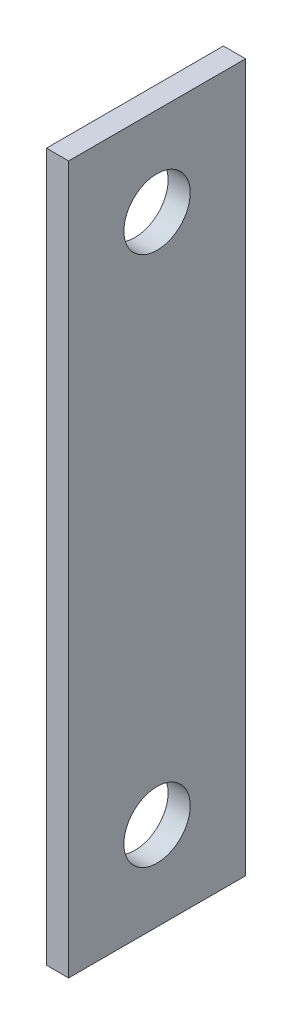
ISO-10303-21;
HEADER;
FILE_DESCRIPTION(('STEP AP214'),'2;1');
FILE_NAME('part.step','',(''),(''),'','','');
FILE_SCHEMA(('AUTOMOTIVE_DESIGN { 1 0 10303 214 1 1 1 1 }'));
ENDSEC;
DATA;
#1=APPLICATION_CONTEXT('core data for automotive mechanical design processes');
#2=APPLICATION_PROTOCOL_DEFINITION('international standard','automotive_design',2000,#1);
#3=PRODUCT_CONTEXT('',#1,'mechanical');
#4=PRODUCT('Part','Part','',(#3));
#5=PRODUCT_RELATED_PRODUCT_CATEGORY('part','',(#4));
#6=PRODUCT_DEFINITION_FORMATION('','',#4);
#7=PRODUCT_DEFINITION_CONTEXT('part definition',#1,'design');
#8=PRODUCT_DEFINITION('design','',#6,#7);
#9=PRODUCT_DEFINITION_SHAPE('','',#8);
#10=(LENGTH_UNIT() NAMED_UNIT(*) SI_UNIT(.MILLI.,.METRE.));
#11=(NAMED_UNIT(*) PLANE_ANGLE_UNIT() SI_UNIT($,.RADIAN.));
#12=(NAMED_UNIT(*) SI_UNIT($,.STERADIAN.) SOLID_ANGLE_UNIT());
#13=UNCERTAINTY_MEASURE_WITH_UNIT(LENGTH_MEASURE(1.E-05),#10,'distance_accuracy_value','');
#14=(GEOMETRIC_REPRESENTATION_CONTEXT(3) GLOBAL_UNCERTAINTY_ASSIGNED_CONTEXT((#13)) GLOBAL_UNIT_ASSIGNED_CONTEXT((#10,
#11,#12)) REPRESENTATION_CONTEXT('',''));
#15=CARTESIAN_POINT('',(0.,0.,0.));
#16=DIRECTION('',(0.,0.,1.));
#17=DIRECTION('',(1.,0.,0.));
#18=AXIS2_PLACEMENT_3D('',#15,#16,#17);
#19=CARTESIAN_POINT('',(3.175,0.,0.));
#20=DIRECTION('',(-1.,0.,0.));
#21=DIRECTION('',(0.,0.,1.));
#22=AXIS2_PLACEMENT_3D('',#19,#20,#21);
#23=PLANE('',#22);
#24=DIRECTION('',(0.,1.,0.));
#25=VECTOR('',#24,1.);
#26=CARTESIAN_POINT('',(3.175,-50.8,-12.7));
#27=LINE('',#26,#25);
#28=CARTESIAN_POINT('',(3.175,-50.8,-12.7));
#29=VERTEX_POINT('',#28);
#30=CARTESIAN_POINT('',(3.175,50.8,-12.7));
#31=VERTEX_POINT('',#30);
#32=EDGE_CURVE('E89',#29,#31,#27,.T.);
#33=ORIENTED_EDGE('',*,*,#32,.T.);
#34=DIRECTION('',(0.,0.,1.));
#35=VECTOR('',#34,1.);
#36=CARTESIAN_POINT('',(3.175,50.8,12.7));
#37=LINE('',#36,#35);
#38=CARTESIAN_POINT('',(3.175,50.8,12.7));
#39=VERTEX_POINT('',#38);
#40=EDGE_CURVE('E84',#31,#39,#37,.T.);
#41=ORIENTED_EDGE('',*,*,#40,.T.);
#42=DIRECTION('',(0.,-1.,0.));
#43=VECTOR('',#42,1.);
#44=CARTESIAN_POINT('',(3.175,-50.8,12.7));
#45=LINE('',#44,#43);
#46=CARTESIAN_POINT('',(3.175,-50.8,12.7));
#47=VERTEX_POINT('',#46);
#48=EDGE_CURVE('E87',#39,#47,#45,.T.);
#49=ORIENTED_EDGE('',*,*,#48,.T.);
#50=DIRECTION('',(0.,0.,-1.));
#51=VECTOR('',#50,1.);
#52=CARTESIAN_POINT('',(3.175,-50.8,12.7));
#53=LINE('',#52,#51);
#54=EDGE_CURVE('E54',#47,#29,#53,.T.);
#55=ORIENTED_EDGE('',*,*,#54,.T.);
#56=EDGE_LOOP('',(#33,#41,#49,#55));
#57=FACE_BOUND('',#56,.T.);
#58=CARTESIAN_POINT('',(3.175,38.1,0.));
#59=DIRECTION('',(1.,0.,0.));
#60=DIRECTION('',(0.,0.,-1.));
#61=AXIS2_PLACEMENT_3D('',#58,#59,#60);
#62=CIRCLE('',#61,4.7625);
#63=CARTESIAN_POINT('',(3.175,38.1,-4.7625));
#64=VERTEX_POINT('',#63);
#65=EDGE_CURVE('E104',#64,#64,#62,.T.);
#66=ORIENTED_EDGE('',*,*,#65,.F.);
#67=EDGE_LOOP('',(#66));
#68=FACE_BOUND('',#67,.T.);
#69=CARTESIAN_POINT('',(3.175,-38.1,0.));
#70=DIRECTION('',(1.,0.,0.));
#71=DIRECTION('',(0.,0.,-1.));
#72=AXIS2_PLACEMENT_3D('',#69,#70,#71);
#73=CIRCLE('',#72,4.7625);
#74=CARTESIAN_POINT('',(3.175,-38.1,-4.7625));
#75=VERTEX_POINT('',#74);
#76=EDGE_CURVE('E119',#75,#75,#73,.T.);
#77=ORIENTED_EDGE('',*,*,#76,.F.);
#78=EDGE_LOOP('',(#77));
#79=FACE_BOUND('',#78,.T.);
#80=ADVANCED_FACE('F37',(#57,#68,#79),#23,.F.);
#81=CARTESIAN_POINT('',(0.,0.,0.));
#82=DIRECTION('',(-1.,0.,0.));
#83=DIRECTION('',(0.,0.,1.));
#84=AXIS2_PLACEMENT_3D('',#81,#82,#83);
#85=PLANE('',#84);
#86=CARTESIAN_POINT('',(0.,38.1,0.));
#87=DIRECTION('',(1.,0.,0.));
#88=DIRECTION('',(0.,0.,-1.));
#89=AXIS2_PLACEMENT_3D('',#86,#87,#88);
#90=CIRCLE('',#89,4.7625);
#91=CARTESIAN_POINT('',(0.,38.1,-4.7625));
#92=VERTEX_POINT('',#91);
#93=EDGE_CURVE('E116',#92,#92,#90,.T.);
#94=ORIENTED_EDGE('',*,*,#93,.T.);
#95=EDGE_LOOP('',(#94));
#96=FACE_BOUND('',#95,.T.);
#97=DIRECTION('',(0.,1.,0.));
#98=VECTOR('',#97,1.);
#99=CARTESIAN_POINT('',(0.,-50.8,-12.7));
#100=LINE('',#99,#98);
#101=CARTESIAN_POINT('',(0.,-50.8,-12.7));
#102=VERTEX_POINT('',#101);
#103=CARTESIAN_POINT('',(0.,50.8,-12.7));
#104=VERTEX_POINT('',#103);
#105=EDGE_CURVE('E101',#102,#104,#100,.T.);
#106=ORIENTED_EDGE('',*,*,#105,.F.);
#107=DIRECTION('',(0.,0.,-1.));
#108=VECTOR('',#107,1.);
#109=CARTESIAN_POINT('',(0.,-50.8,12.7));
#110=LINE('',#109,#108);
#111=CARTESIAN_POINT('',(0.,-50.8,12.7));
#112=VERTEX_POINT('',#111);
#113=EDGE_CURVE('E77',#112,#102,#110,.T.);
#114=ORIENTED_EDGE('',*,*,#113,.F.);
#115=DIRECTION('',(0.,-1.,0.));
#116=VECTOR('',#115,1.);
#117=CARTESIAN_POINT('',(0.,-50.8,12.7));
#118=LINE('',#117,#116);
#119=CARTESIAN_POINT('',(0.,50.8,12.7));
#120=VERTEX_POINT('',#119);
#121=EDGE_CURVE('E71',#120,#112,#118,.T.);
#122=ORIENTED_EDGE('',*,*,#121,.F.);
#123=DIRECTION('',(0.,0.,1.));
#124=VECTOR('',#123,1.);
#125=CARTESIAN_POINT('',(0.,50.8,12.7));
#126=LINE('',#125,#124);
#127=EDGE_CURVE('E93',#104,#120,#126,.T.);
#128=ORIENTED_EDGE('',*,*,#127,.F.);
#129=EDGE_LOOP('',(#106,#114,#122,#128));
#130=FACE_BOUND('',#129,.T.);
#131=CARTESIAN_POINT('',(0.,-38.1,0.));
#132=DIRECTION('',(1.,0.,0.));
#133=DIRECTION('',(0.,0.,-1.));
#134=AXIS2_PLACEMENT_3D('',#131,#132,#133);
#135=CIRCLE('',#134,4.7625);
#136=CARTESIAN_POINT('',(0.,-38.1,-4.7625));
#137=VERTEX_POINT('',#136);
#138=EDGE_CURVE('E122',#137,#137,#135,.T.);
#139=ORIENTED_EDGE('',*,*,#138,.T.);
#140=EDGE_LOOP('',(#139));
#141=FACE_BOUND('',#140,.T.);
#142=ADVANCED_FACE('F112',(#96,#130,#141),#85,.T.);
#143=CARTESIAN_POINT('',(3.175,-50.8,-12.7));
#144=DIRECTION('',(0.,0.,1.));
#145=DIRECTION('',(1.,0.,0.));
#146=AXIS2_PLACEMENT_3D('',#143,#144,#145);
#147=PLANE('',#146);
#148=ORIENTED_EDGE('',*,*,#105,.T.);
#149=DIRECTION('',(-1.,0.,0.));
#150=VECTOR('',#149,1.);
#151=CARTESIAN_POINT('',(3.175,50.8,-12.7));
#152=LINE('',#151,#150);
#153=EDGE_CURVE('E11',#31,#104,#152,.T.);
#154=ORIENTED_EDGE('',*,*,#153,.F.);
#155=ORIENTED_EDGE('',*,*,#32,.F.);
#156=DIRECTION('',(-1.,0.,0.));
#157=VECTOR('',#156,1.);
#158=CARTESIAN_POINT('',(3.175,-50.8,-12.7));
#159=LINE('',#158,#157);
#160=EDGE_CURVE('E97',#29,#102,#159,.T.);
#161=ORIENTED_EDGE('',*,*,#160,.T.);
#162=EDGE_LOOP('',(#148,#154,#155,#161));
#163=FACE_BOUND('',#162,.T.);
#164=ADVANCED_FACE('F39',(#163),#147,.F.);
#165=CARTESIAN_POINT('',(3.175,50.8,12.7));
#166=DIRECTION('',(0.,-1.,0.));
#167=DIRECTION('',(0.,0.,-1.));
#168=AXIS2_PLACEMENT_3D('',#165,#166,#167);
#169=PLANE('',#168);
#170=ORIENTED_EDGE('',*,*,#127,.T.);
#171=DIRECTION('',(-1.,0.,0.));
#172=VECTOR('',#171,1.);
#173=CARTESIAN_POINT('',(3.175,50.8,12.7));
#174=LINE('',#173,#172);
#175=EDGE_CURVE('E46',#39,#120,#174,.T.);
#176=ORIENTED_EDGE('',*,*,#175,.F.);
#177=ORIENTED_EDGE('',*,*,#40,.F.);
#178=ORIENTED_EDGE('',*,*,#153,.T.);
#179=EDGE_LOOP('',(#170,#176,#177,#178));
#180=FACE_BOUND('',#179,.T.);
#181=ADVANCED_FACE('F92',(#180),#169,.F.);
#182=CARTESIAN_POINT('',(3.175,-50.8,12.7));
#183=DIRECTION('',(0.,0.,-1.));
#184=DIRECTION('',(-1.,0.,0.));
#185=AXIS2_PLACEMENT_3D('',#182,#183,#184);
#186=PLANE('',#185);
#187=ORIENTED_EDGE('',*,*,#121,.T.);
#188=DIRECTION('',(-1.,0.,0.));
#189=VECTOR('',#188,1.);
#190=CARTESIAN_POINT('',(3.175,-50.8,12.7));
#191=LINE('',#190,#189);
#192=EDGE_CURVE('E94',#47,#112,#191,.T.);
#193=ORIENTED_EDGE('',*,*,#192,.F.);
#194=ORIENTED_EDGE('',*,*,#48,.F.);
#195=ORIENTED_EDGE('',*,*,#175,.T.);
#196=EDGE_LOOP('',(#187,#193,#194,#195));
#197=FACE_BOUND('',#196,.T.);
#198=ADVANCED_FACE('F95',(#197),#186,.F.);
#199=CARTESIAN_POINT('',(3.175,-50.8,12.7));
#200=DIRECTION('',(0.,1.,0.));
#201=DIRECTION('',(0.,0.,1.));
#202=AXIS2_PLACEMENT_3D('',#199,#200,#201);
#203=PLANE('',#202);
#204=ORIENTED_EDGE('',*,*,#113,.T.);
#205=ORIENTED_EDGE('',*,*,#160,.F.);
#206=ORIENTED_EDGE('',*,*,#54,.F.);
#207=ORIENTED_EDGE('',*,*,#192,.T.);
#208=EDGE_LOOP('',(#204,#205,#206,#207));
#209=FACE_BOUND('',#208,.T.);
#210=ADVANCED_FACE('F109',(#209),#203,.F.);
#211=CARTESIAN_POINT('',(3.175,38.1,0.));
#212=DIRECTION('',(-1.,0.,0.));
#213=DIRECTION('',(0.,0.,1.));
#214=AXIS2_PLACEMENT_3D('',#211,#212,#213);
#215=CYLINDRICAL_SURFACE('',#214,4.7625);
#216=ORIENTED_EDGE('',*,*,#65,.T.);
#217=EDGE_LOOP('',(#216));
#218=FACE_BOUND('',#217,.T.);
#219=ORIENTED_EDGE('',*,*,#93,.F.);
#220=EDGE_LOOP('',(#219));
#221=FACE_BOUND('',#220,.T.);
#222=ADVANCED_FACE('F139',(#218,#221),#215,.F.);
#223=CARTESIAN_POINT('',(3.175,-38.1,0.));
#224=DIRECTION('',(-1.,0.,0.));
#225=DIRECTION('',(0.,0.,1.));
#226=AXIS2_PLACEMENT_3D('',#223,#224,#225);
#227=CYLINDRICAL_SURFACE('',#226,4.7625);
#228=ORIENTED_EDGE('',*,*,#76,.T.);
#229=EDGE_LOOP('',(#228));
#230=FACE_BOUND('',#229,.T.);
#231=ORIENTED_EDGE('',*,*,#138,.F.);
#232=EDGE_LOOP('',(#231));
#233=FACE_BOUND('',#232,.T.);
#234=ADVANCED_FACE('F128',(#230,#233),#227,.F.);
#235=CLOSED_SHELL('',(#80,#142,#164,#181,#198,#210,#222,#234));
#236=MANIFOLD_SOLID_BREP('B2',#235);
#237=ADVANCED_BREP_SHAPE_REPRESENTATION('',(#18,#236),#14);
#238=SHAPE_DEFINITION_REPRESENTATION(#9,#237);
ENDSEC;
END-ISO-10303-21;
